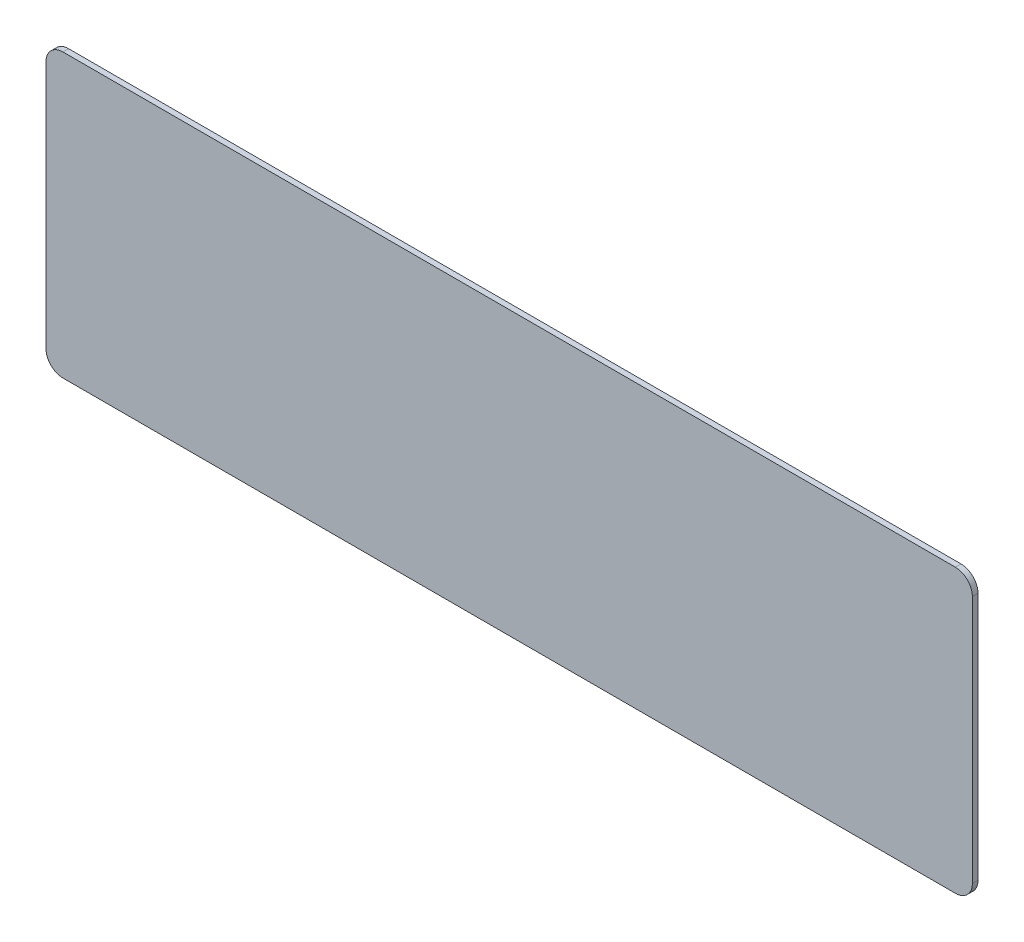
ISO-10303-21;
HEADER;
FILE_DESCRIPTION(('STEP AP214'),'2;1');
FILE_NAME('part.step','',(''),(''),'','','');
FILE_SCHEMA(('AUTOMOTIVE_DESIGN { 1 0 10303 214 1 1 1 1 }'));
ENDSEC;
DATA;
#1=APPLICATION_CONTEXT('core data for automotive mechanical design processes');
#2=APPLICATION_PROTOCOL_DEFINITION('international standard','automotive_design',2000,#1);
#3=PRODUCT_CONTEXT('',#1,'mechanical');
#4=PRODUCT('Part','Part','',(#3));
#5=PRODUCT_RELATED_PRODUCT_CATEGORY('part','',(#4));
#6=PRODUCT_DEFINITION_FORMATION('','',#4);
#7=PRODUCT_DEFINITION_CONTEXT('part definition',#1,'design');
#8=PRODUCT_DEFINITION('design','',#6,#7);
#9=PRODUCT_DEFINITION_SHAPE('','',#8);
#10=(LENGTH_UNIT() NAMED_UNIT(*) SI_UNIT(.MILLI.,.METRE.));
#11=(NAMED_UNIT(*) PLANE_ANGLE_UNIT() SI_UNIT($,.RADIAN.));
#12=(NAMED_UNIT(*) SI_UNIT($,.STERADIAN.) SOLID_ANGLE_UNIT());
#13=UNCERTAINTY_MEASURE_WITH_UNIT(LENGTH_MEASURE(1.E-05),#10,'distance_accuracy_value','');
#14=(GEOMETRIC_REPRESENTATION_CONTEXT(3) GLOBAL_UNCERTAINTY_ASSIGNED_CONTEXT((#13)) GLOBAL_UNIT_ASSIGNED_CONTEXT((#10,
#11,#12)) REPRESENTATION_CONTEXT('',''));
#15=CARTESIAN_POINT('',(0.,0.,0.));
#16=DIRECTION('',(0.,0.,1.));
#17=DIRECTION('',(1.,0.,0.));
#18=AXIS2_PLACEMENT_3D('',#15,#16,#17);
#19=CARTESIAN_POINT('',(82.,25.,1.));
#20=DIRECTION('',(-1.,0.,0.));
#21=DIRECTION('',(0.,0.,1.));
#22=AXIS2_PLACEMENT_3D('',#19,#20,#21);
#23=PLANE('',#22);
#24=DIRECTION('',(0.,1.,0.));
#25=VECTOR('',#24,1.);
#26=CARTESIAN_POINT('',(82.,25.,1.));
#27=LINE('',#26,#25);
#28=CARTESIAN_POINT('',(82.,-22.,1.));
#29=VERTEX_POINT('',#28);
#30=CARTESIAN_POINT('',(82.,22.,1.));
#31=VERTEX_POINT('',#30);
#32=EDGE_CURVE('E125',#29,#31,#27,.T.);
#33=ORIENTED_EDGE('',*,*,#32,.F.);
#34=DIRECTION('',(0.,0.,-1.));
#35=VECTOR('',#34,1.);
#36=CARTESIAN_POINT('',(82.,-22.,1.));
#37=LINE('',#36,#35);
#38=CARTESIAN_POINT('',(82.,-22.,0.));
#39=VERTEX_POINT('',#38);
#40=EDGE_CURVE('E110',#29,#39,#37,.T.);
#41=ORIENTED_EDGE('',*,*,#40,.T.);
#42=DIRECTION('',(0.,1.,0.));
#43=VECTOR('',#42,1.);
#44=CARTESIAN_POINT('',(82.,25.,0.));
#45=LINE('',#44,#43);
#46=CARTESIAN_POINT('',(82.,22.,0.));
#47=VERTEX_POINT('',#46);
#48=EDGE_CURVE('E122',#39,#47,#45,.T.);
#49=ORIENTED_EDGE('',*,*,#48,.T.);
#50=DIRECTION('',(0.,0.,-1.));
#51=VECTOR('',#50,1.);
#52=CARTESIAN_POINT('',(82.,22.,1.));
#53=LINE('',#52,#51);
#54=EDGE_CURVE('E127',#47,#31,#53,.F.);
#55=ORIENTED_EDGE('',*,*,#54,.T.);
#56=EDGE_LOOP('',(#33,#41,#49,#55));
#57=FACE_BOUND('',#56,.T.);
#58=ADVANCED_FACE('F41',(#57),#23,.F.);
#59=CARTESIAN_POINT('',(-82.,25.,1.));
#60=DIRECTION('',(0.,-1.,0.));
#61=DIRECTION('',(0.,0.,-1.));
#62=AXIS2_PLACEMENT_3D('',#59,#60,#61);
#63=PLANE('',#62);
#64=DIRECTION('',(-1.,0.,0.));
#65=VECTOR('',#64,1.);
#66=CARTESIAN_POINT('',(-82.,25.,1.));
#67=LINE('',#66,#65);
#68=CARTESIAN_POINT('',(79.,25.,1.));
#69=VERTEX_POINT('',#68);
#70=CARTESIAN_POINT('',(-79.,25.,1.));
#71=VERTEX_POINT('',#70);
#72=EDGE_CURVE('E176',#69,#71,#67,.T.);
#73=ORIENTED_EDGE('',*,*,#72,.F.);
#74=DIRECTION('',(0.,0.,-1.));
#75=VECTOR('',#74,1.);
#76=CARTESIAN_POINT('',(79.,25.,1.));
#77=LINE('',#76,#75);
#78=CARTESIAN_POINT('',(79.,25.,0.));
#79=VERTEX_POINT('',#78);
#80=EDGE_CURVE('E160',#69,#79,#77,.T.);
#81=ORIENTED_EDGE('',*,*,#80,.T.);
#82=DIRECTION('',(-1.,0.,0.));
#83=VECTOR('',#82,1.);
#84=CARTESIAN_POINT('',(-82.,25.,0.));
#85=LINE('',#84,#83);
#86=CARTESIAN_POINT('',(-79.,25.,0.));
#87=VERTEX_POINT('',#86);
#88=EDGE_CURVE('E131',#79,#87,#85,.T.);
#89=ORIENTED_EDGE('',*,*,#88,.T.);
#90=DIRECTION('',(0.,0.,-1.));
#91=VECTOR('',#90,1.);
#92=CARTESIAN_POINT('',(-79.,25.,1.));
#93=LINE('',#92,#91);
#94=EDGE_CURVE('E158',#87,#71,#93,.F.);
#95=ORIENTED_EDGE('',*,*,#94,.T.);
#96=EDGE_LOOP('',(#73,#81,#89,#95));
#97=FACE_BOUND('',#96,.T.);
#98=ADVANCED_FACE('F186',(#97),#63,.F.);
#99=CARTESIAN_POINT('',(-82.,25.,1.));
#100=DIRECTION('',(1.,0.,0.));
#101=DIRECTION('',(0.,0.,-1.));
#102=AXIS2_PLACEMENT_3D('',#99,#100,#101);
#103=PLANE('',#102);
#104=DIRECTION('',(0.,-1.,0.));
#105=VECTOR('',#104,1.);
#106=CARTESIAN_POINT('',(-82.,25.,0.));
#107=LINE('',#106,#105);
#108=CARTESIAN_POINT('',(-82.,22.,0.));
#109=VERTEX_POINT('',#108);
#110=CARTESIAN_POINT('',(-82.,-22.,0.));
#111=VERTEX_POINT('',#110);
#112=EDGE_CURVE('E134',#109,#111,#107,.T.);
#113=ORIENTED_EDGE('',*,*,#112,.T.);
#114=DIRECTION('',(0.,0.,-1.));
#115=VECTOR('',#114,1.);
#116=CARTESIAN_POINT('',(-82.,-22.,1.));
#117=LINE('',#116,#115);
#118=CARTESIAN_POINT('',(-82.,-22.,1.));
#119=VERTEX_POINT('',#118);
#120=EDGE_CURVE('E11',#111,#119,#117,.F.);
#121=ORIENTED_EDGE('',*,*,#120,.T.);
#122=DIRECTION('',(0.,-1.,0.));
#123=VECTOR('',#122,1.);
#124=CARTESIAN_POINT('',(-82.,25.,1.));
#125=LINE('',#124,#123);
#126=CARTESIAN_POINT('',(-82.,22.,1.));
#127=VERTEX_POINT('',#126);
#128=EDGE_CURVE('E166',#127,#119,#125,.T.);
#129=ORIENTED_EDGE('',*,*,#128,.F.);
#130=DIRECTION('',(0.,0.,-1.));
#131=VECTOR('',#130,1.);
#132=CARTESIAN_POINT('',(-82.,22.,1.));
#133=LINE('',#132,#131);
#134=EDGE_CURVE('E49',#127,#109,#133,.T.);
#135=ORIENTED_EDGE('',*,*,#134,.T.);
#136=EDGE_LOOP('',(#113,#121,#129,#135));
#137=FACE_BOUND('',#136,.T.);
#138=ADVANCED_FACE('F165',(#137),#103,.F.);
#139=CARTESIAN_POINT('',(-82.,-25.,1.));
#140=DIRECTION('',(0.,1.,0.));
#141=DIRECTION('',(0.,0.,1.));
#142=AXIS2_PLACEMENT_3D('',#139,#140,#141);
#143=PLANE('',#142);
#144=DIRECTION('',(1.,0.,0.));
#145=VECTOR('',#144,1.);
#146=CARTESIAN_POINT('',(-82.,-25.,0.));
#147=LINE('',#146,#145);
#148=CARTESIAN_POINT('',(-79.,-25.,0.));
#149=VERTEX_POINT('',#148);
#150=CARTESIAN_POINT('',(79.,-25.,0.));
#151=VERTEX_POINT('',#150);
#152=EDGE_CURVE('E141',#149,#151,#147,.T.);
#153=ORIENTED_EDGE('',*,*,#152,.T.);
#154=DIRECTION('',(0.,0.,-1.));
#155=VECTOR('',#154,1.);
#156=CARTESIAN_POINT('',(79.,-25.,1.));
#157=LINE('',#156,#155);
#158=CARTESIAN_POINT('',(79.,-25.,1.));
#159=VERTEX_POINT('',#158);
#160=EDGE_CURVE('E111',#151,#159,#157,.F.);
#161=ORIENTED_EDGE('',*,*,#160,.T.);
#162=DIRECTION('',(1.,0.,0.));
#163=VECTOR('',#162,1.);
#164=CARTESIAN_POINT('',(-82.,-25.,1.));
#165=LINE('',#164,#163);
#166=CARTESIAN_POINT('',(-79.,-25.,1.));
#167=VERTEX_POINT('',#166);
#168=EDGE_CURVE('E137',#167,#159,#165,.T.);
#169=ORIENTED_EDGE('',*,*,#168,.F.);
#170=DIRECTION('',(0.,0.,-1.));
#171=VECTOR('',#170,1.);
#172=CARTESIAN_POINT('',(-79.,-25.,1.));
#173=LINE('',#172,#171);
#174=EDGE_CURVE('E116',#167,#149,#173,.T.);
#175=ORIENTED_EDGE('',*,*,#174,.T.);
#176=EDGE_LOOP('',(#153,#161,#169,#175));
#177=FACE_BOUND('',#176,.T.);
#178=ADVANCED_FACE('F174',(#177),#143,.F.);
#179=CARTESIAN_POINT('',(0.,0.,1.));
#180=DIRECTION('',(0.,0.,1.));
#181=DIRECTION('',(1.,0.,0.));
#182=AXIS2_PLACEMENT_3D('',#179,#180,#181);
#183=PLANE('',#182);
#184=ORIENTED_EDGE('',*,*,#168,.T.);
#185=CARTESIAN_POINT('',(79.,-22.,1.));
#186=DIRECTION('',(0.,0.,1.));
#187=DIRECTION('',(1.,0.,0.));
#188=AXIS2_PLACEMENT_3D('',#185,#186,#187);
#189=CIRCLE('',#188,3.);
#190=EDGE_CURVE('E156',#159,#29,#189,.T.);
#191=ORIENTED_EDGE('',*,*,#190,.T.);
#192=ORIENTED_EDGE('',*,*,#32,.T.);
#193=CARTESIAN_POINT('',(79.,22.,1.));
#194=DIRECTION('',(0.,0.,1.));
#195=DIRECTION('',(1.,0.,0.));
#196=AXIS2_PLACEMENT_3D('',#193,#194,#195);
#197=CIRCLE('',#196,3.);
#198=EDGE_CURVE('E154',#31,#69,#197,.T.);
#199=ORIENTED_EDGE('',*,*,#198,.T.);
#200=ORIENTED_EDGE('',*,*,#72,.T.);
#201=CARTESIAN_POINT('',(-79.,22.,1.));
#202=DIRECTION('',(0.,0.,1.));
#203=DIRECTION('',(1.,0.,0.));
#204=AXIS2_PLACEMENT_3D('',#201,#202,#203);
#205=CIRCLE('',#204,3.);
#206=EDGE_CURVE('E61',#71,#127,#205,.T.);
#207=ORIENTED_EDGE('',*,*,#206,.T.);
#208=ORIENTED_EDGE('',*,*,#128,.T.);
#209=CARTESIAN_POINT('',(-79.,-22.,1.));
#210=DIRECTION('',(0.,0.,1.));
#211=DIRECTION('',(1.,0.,0.));
#212=AXIS2_PLACEMENT_3D('',#209,#210,#211);
#213=CIRCLE('',#212,3.);
#214=EDGE_CURVE('E152',#119,#167,#213,.T.);
#215=ORIENTED_EDGE('',*,*,#214,.T.);
#216=EDGE_LOOP('',(#184,#191,#192,#199,#200,#207,#208,#215));
#217=FACE_BOUND('',#216,.T.);
#218=ADVANCED_FACE('F180',(#217),#183,.T.);
#219=CARTESIAN_POINT('',(0.,0.,0.));
#220=DIRECTION('',(0.,0.,1.));
#221=DIRECTION('',(1.,0.,0.));
#222=AXIS2_PLACEMENT_3D('',#219,#220,#221);
#223=PLANE('',#222);
#224=ORIENTED_EDGE('',*,*,#48,.F.);
#225=CARTESIAN_POINT('',(79.,-22.,0.));
#226=DIRECTION('',(0.,0.,1.));
#227=DIRECTION('',(1.,0.,0.));
#228=AXIS2_PLACEMENT_3D('',#225,#226,#227);
#229=CIRCLE('',#228,3.);
#230=EDGE_CURVE('E106',#39,#151,#229,.F.);
#231=ORIENTED_EDGE('',*,*,#230,.T.);
#232=ORIENTED_EDGE('',*,*,#152,.F.);
#233=CARTESIAN_POINT('',(-79.,-22.,0.));
#234=DIRECTION('',(0.,0.,1.));
#235=DIRECTION('',(1.,0.,0.));
#236=AXIS2_PLACEMENT_3D('',#233,#234,#235);
#237=CIRCLE('',#236,3.);
#238=EDGE_CURVE('E145',#149,#111,#237,.F.);
#239=ORIENTED_EDGE('',*,*,#238,.T.);
#240=ORIENTED_EDGE('',*,*,#112,.F.);
#241=CARTESIAN_POINT('',(-79.,22.,0.));
#242=DIRECTION('',(0.,0.,1.));
#243=DIRECTION('',(1.,0.,0.));
#244=AXIS2_PLACEMENT_3D('',#241,#242,#243);
#245=CIRCLE('',#244,3.);
#246=EDGE_CURVE('E126',#109,#87,#245,.F.);
#247=ORIENTED_EDGE('',*,*,#246,.T.);
#248=ORIENTED_EDGE('',*,*,#88,.F.);
#249=CARTESIAN_POINT('',(79.,22.,0.));
#250=DIRECTION('',(0.,0.,1.));
#251=DIRECTION('',(1.,0.,0.));
#252=AXIS2_PLACEMENT_3D('',#249,#250,#251);
#253=CIRCLE('',#252,3.);
#254=EDGE_CURVE('E117',#79,#47,#253,.F.);
#255=ORIENTED_EDGE('',*,*,#254,.T.);
#256=EDGE_LOOP('',(#224,#231,#232,#239,#240,#247,#248,#255));
#257=FACE_BOUND('',#256,.T.);
#258=ADVANCED_FACE('F129',(#257),#223,.F.);
#259=CARTESIAN_POINT('',(79.,-22.,1.));
#260=DIRECTION('',(0.,0.,-1.));
#261=DIRECTION('',(-1.,0.,0.));
#262=AXIS2_PLACEMENT_3D('',#259,#260,#261);
#263=CYLINDRICAL_SURFACE('',#262,3.);
#264=ORIENTED_EDGE('',*,*,#190,.F.);
#265=ORIENTED_EDGE('',*,*,#160,.F.);
#266=ORIENTED_EDGE('',*,*,#230,.F.);
#267=ORIENTED_EDGE('',*,*,#40,.F.);
#268=EDGE_LOOP('',(#264,#265,#266,#267));
#269=FACE_BOUND('',#268,.T.);
#270=ADVANCED_FACE('F109',(#269),#263,.T.);
#271=CARTESIAN_POINT('',(79.,22.,1.));
#272=DIRECTION('',(0.,0.,-1.));
#273=DIRECTION('',(-1.,0.,0.));
#274=AXIS2_PLACEMENT_3D('',#271,#272,#273);
#275=CYLINDRICAL_SURFACE('',#274,3.);
#276=ORIENTED_EDGE('',*,*,#198,.F.);
#277=ORIENTED_EDGE('',*,*,#54,.F.);
#278=ORIENTED_EDGE('',*,*,#254,.F.);
#279=ORIENTED_EDGE('',*,*,#80,.F.);
#280=EDGE_LOOP('',(#276,#277,#278,#279));
#281=FACE_BOUND('',#280,.T.);
#282=ADVANCED_FACE('F184',(#281),#275,.T.);
#283=CARTESIAN_POINT('',(-79.,-22.,1.));
#284=DIRECTION('',(0.,0.,-1.));
#285=DIRECTION('',(-1.,0.,0.));
#286=AXIS2_PLACEMENT_3D('',#283,#284,#285);
#287=CYLINDRICAL_SURFACE('',#286,3.);
#288=ORIENTED_EDGE('',*,*,#214,.F.);
#289=ORIENTED_EDGE('',*,*,#120,.F.);
#290=ORIENTED_EDGE('',*,*,#238,.F.);
#291=ORIENTED_EDGE('',*,*,#174,.F.);
#292=EDGE_LOOP('',(#288,#289,#290,#291));
#293=FACE_BOUND('',#292,.T.);
#294=ADVANCED_FACE('F171',(#293),#287,.T.);
#295=CARTESIAN_POINT('',(-79.,22.,1.));
#296=DIRECTION('',(0.,0.,-1.));
#297=DIRECTION('',(-1.,0.,0.));
#298=AXIS2_PLACEMENT_3D('',#295,#296,#297);
#299=CYLINDRICAL_SURFACE('',#298,3.);
#300=ORIENTED_EDGE('',*,*,#206,.F.);
#301=ORIENTED_EDGE('',*,*,#94,.F.);
#302=ORIENTED_EDGE('',*,*,#246,.F.);
#303=ORIENTED_EDGE('',*,*,#134,.F.);
#304=EDGE_LOOP('',(#300,#301,#302,#303));
#305=FACE_BOUND('',#304,.T.);
#306=ADVANCED_FACE('F43',(#305),#299,.T.);
#307=CLOSED_SHELL('',(#58,#98,#138,#178,#218,#258,#270,#282,#294,#306));
#308=MANIFOLD_SOLID_BREP('B2',#307);
#309=ADVANCED_BREP_SHAPE_REPRESENTATION('',(#18,#308),#14);
#310=SHAPE_DEFINITION_REPRESENTATION(#9,#309);
ENDSEC;
END-ISO-10303-21;
